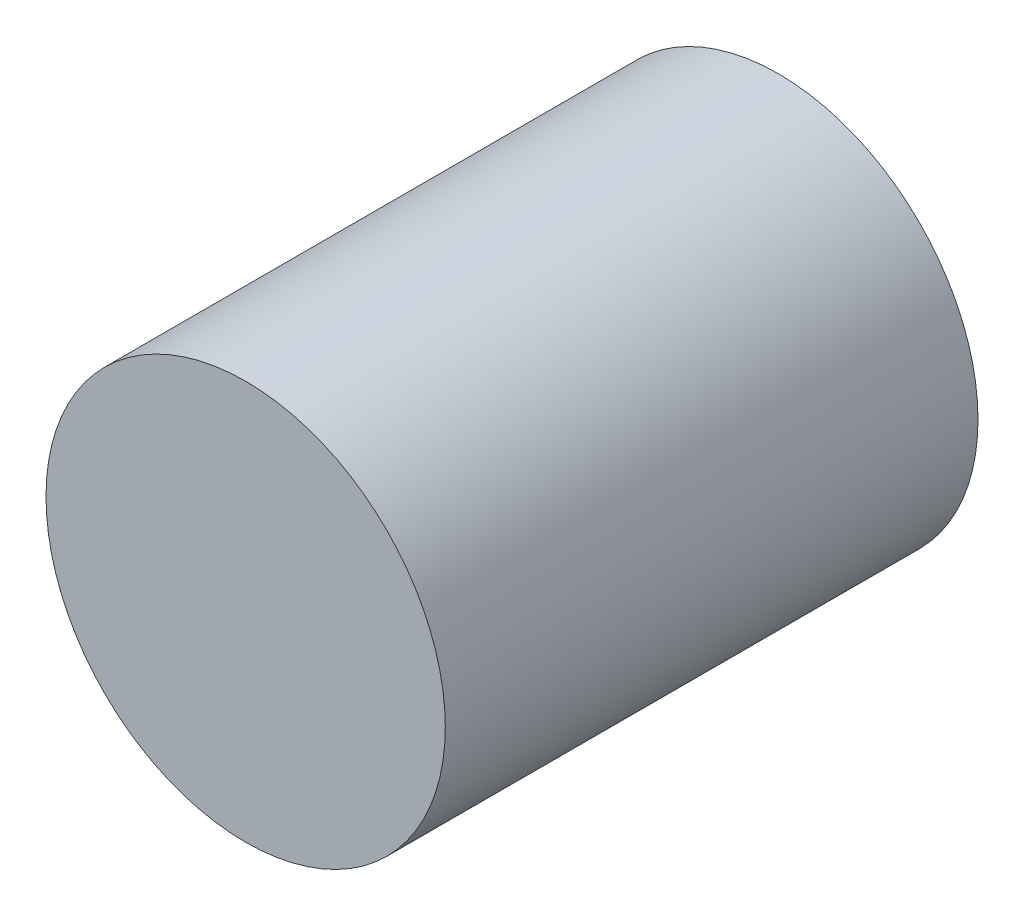
ISO-10303-21;
HEADER;
FILE_DESCRIPTION(('STEP AP214'),'2;1');
FILE_NAME('part.step','',(''),(''),'','','');
FILE_SCHEMA(('AUTOMOTIVE_DESIGN { 1 0 10303 214 1 1 1 1 }'));
ENDSEC;
DATA;
#1=APPLICATION_CONTEXT('core data for automotive mechanical design processes');
#2=APPLICATION_PROTOCOL_DEFINITION('international standard','automotive_design',2000,#1);
#3=PRODUCT_CONTEXT('',#1,'mechanical');
#4=PRODUCT('Part','Part','',(#3));
#5=PRODUCT_RELATED_PRODUCT_CATEGORY('part','',(#4));
#6=PRODUCT_DEFINITION_FORMATION('','',#4);
#7=PRODUCT_DEFINITION_CONTEXT('part definition',#1,'design');
#8=PRODUCT_DEFINITION('design','',#6,#7);
#9=PRODUCT_DEFINITION_SHAPE('','',#8);
#10=(LENGTH_UNIT() NAMED_UNIT(*) SI_UNIT(.MILLI.,.METRE.));
#11=(NAMED_UNIT(*) PLANE_ANGLE_UNIT() SI_UNIT($,.RADIAN.));
#12=(NAMED_UNIT(*) SI_UNIT($,.STERADIAN.) SOLID_ANGLE_UNIT());
#13=UNCERTAINTY_MEASURE_WITH_UNIT(LENGTH_MEASURE(1.E-05),#10,'distance_accuracy_value','');
#14=(GEOMETRIC_REPRESENTATION_CONTEXT(3) GLOBAL_UNCERTAINTY_ASSIGNED_CONTEXT((#13)) GLOBAL_UNIT_ASSIGNED_CONTEXT((#10,
#11,#12)) REPRESENTATION_CONTEXT('',''));
#15=CARTESIAN_POINT('',(0.,0.,0.));
#16=DIRECTION('',(0.,0.,1.));
#17=DIRECTION('',(1.,0.,0.));
#18=AXIS2_PLACEMENT_3D('',#15,#16,#17);
#19=CARTESIAN_POINT('',(0.,0.,12.7));
#20=DIRECTION('',(0.,0.,-1.));
#21=DIRECTION('',(-1.,0.,0.));
#22=AXIS2_PLACEMENT_3D('',#19,#20,#21);
#23=CYLINDRICAL_SURFACE('',#22,4.76);
#24=CARTESIAN_POINT('',(0.,0.,12.7));
#25=DIRECTION('',(0.,0.,1.));
#26=DIRECTION('',(1.,0.,0.));
#27=AXIS2_PLACEMENT_3D('',#24,#25,#26);
#28=CIRCLE('',#27,4.76);
#29=CARTESIAN_POINT('',(4.76,0.,12.7));
#30=VERTEX_POINT('',#29);
#31=EDGE_CURVE('E10',#30,#30,#28,.T.);
#32=ORIENTED_EDGE('',*,*,#31,.F.);
#33=EDGE_LOOP('',(#32));
#34=FACE_BOUND('',#33,.T.);
#35=CARTESIAN_POINT('',(0.,0.,0.));
#36=DIRECTION('',(0.,0.,1.));
#37=DIRECTION('',(1.,0.,0.));
#38=AXIS2_PLACEMENT_3D('',#35,#36,#37);
#39=CIRCLE('',#38,4.76);
#40=CARTESIAN_POINT('',(4.76,0.,0.));
#41=VERTEX_POINT('',#40);
#42=EDGE_CURVE('E40',#41,#41,#39,.T.);
#43=ORIENTED_EDGE('',*,*,#42,.T.);
#44=EDGE_LOOP('',(#43));
#45=FACE_BOUND('',#44,.T.);
#46=ADVANCED_FACE('F37',(#34,#45),#23,.T.);
#47=CARTESIAN_POINT('',(0.,0.,12.7));
#48=DIRECTION('',(0.,0.,1.));
#49=DIRECTION('',(1.,0.,0.));
#50=AXIS2_PLACEMENT_3D('',#47,#48,#49);
#51=PLANE('',#50);
#52=ORIENTED_EDGE('',*,*,#31,.T.);
#53=EDGE_LOOP('',(#52));
#54=FACE_BOUND('',#53,.T.);
#55=ADVANCED_FACE('F54',(#54),#51,.T.);
#56=CARTESIAN_POINT('',(0.,0.,0.));
#57=DIRECTION('',(0.,0.,1.));
#58=DIRECTION('',(1.,0.,0.));
#59=AXIS2_PLACEMENT_3D('',#56,#57,#58);
#60=PLANE('',#59);
#61=ORIENTED_EDGE('',*,*,#42,.F.);
#62=EDGE_LOOP('',(#61));
#63=FACE_BOUND('',#62,.T.);
#64=ADVANCED_FACE('F52',(#63),#60,.F.);
#65=CLOSED_SHELL('',(#46,#55,#64));
#66=MANIFOLD_SOLID_BREP('B2',#65);
#67=ADVANCED_BREP_SHAPE_REPRESENTATION('',(#18,#66),#14);
#68=SHAPE_DEFINITION_REPRESENTATION(#9,#67);
ENDSEC;
END-ISO-10303-21;
